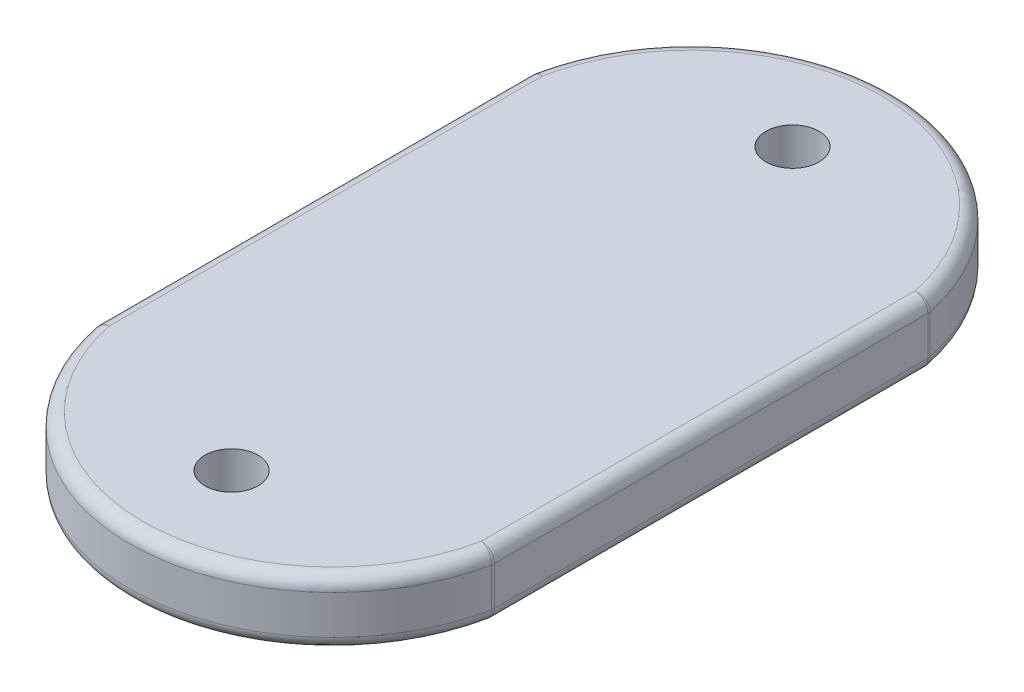
ISO-10303-21;
HEADER;
FILE_DESCRIPTION(('STEP AP214'),'2;1');
FILE_NAME('part.step','',(''),(''),'','','');
FILE_SCHEMA(('AUTOMOTIVE_DESIGN { 1 0 10303 214 1 1 1 1 }'));
ENDSEC;
DATA;
#1=APPLICATION_CONTEXT('core data for automotive mechanical design processes');
#2=APPLICATION_PROTOCOL_DEFINITION('international standard','automotive_design',2000,#1);
#3=PRODUCT_CONTEXT('',#1,'mechanical');
#4=PRODUCT('Part','Part','',(#3));
#5=PRODUCT_RELATED_PRODUCT_CATEGORY('part','',(#4));
#6=PRODUCT_DEFINITION_FORMATION('','',#4);
#7=PRODUCT_DEFINITION_CONTEXT('part definition',#1,'design');
#8=PRODUCT_DEFINITION('design','',#6,#7);
#9=PRODUCT_DEFINITION_SHAPE('','',#8);
#10=(LENGTH_UNIT() NAMED_UNIT(*) SI_UNIT(.MILLI.,.METRE.));
#11=(NAMED_UNIT(*) PLANE_ANGLE_UNIT() SI_UNIT($,.RADIAN.));
#12=(NAMED_UNIT(*) SI_UNIT($,.STERADIAN.) SOLID_ANGLE_UNIT());
#13=UNCERTAINTY_MEASURE_WITH_UNIT(LENGTH_MEASURE(1.E-05),#10,'distance_accuracy_value','');
#14=(GEOMETRIC_REPRESENTATION_CONTEXT(3) GLOBAL_UNCERTAINTY_ASSIGNED_CONTEXT((#13)) GLOBAL_UNIT_ASSIGNED_CONTEXT((#10,
#11,#12)) REPRESENTATION_CONTEXT('',''));
#15=CARTESIAN_POINT('',(0.,0.,0.));
#16=DIRECTION('',(0.,0.,1.));
#17=DIRECTION('',(1.,0.,0.));
#18=AXIS2_PLACEMENT_3D('',#15,#16,#17);
#19=CARTESIAN_POINT('',(0.,10.1031353824411,0.));
#20=DIRECTION('',(0.,1.,0.));
#21=DIRECTION('',(0.,0.,1.));
#22=AXIS2_PLACEMENT_3D('',#19,#20,#21);
#23=PLANE('',#22);
#24=CARTESIAN_POINT('',(0.,10.1031353824411,7.82020619932748));
#25=DIRECTION('',(0.,1.,0.));
#26=DIRECTION('',(0.,0.,1.));
#27=AXIS2_PLACEMENT_3D('',#24,#25,#26);
#28=CIRCLE('',#27,2.05);
#29=CARTESIAN_POINT('',(0.,10.1031353824411,9.87020619932748));
#30=VERTEX_POINT('',#29);
#31=EDGE_CURVE('E172',#30,#30,#28,.T.);
#32=ORIENTED_EDGE('',*,*,#31,.T.);
#33=EDGE_LOOP('',(#32));
#34=FACE_BOUND('',#33,.T.);
#35=CARTESIAN_POINT('',(0.,10.1031353824411,-27.6));
#36=DIRECTION('',(0.,1.,0.));
#37=DIRECTION('',(0.,0.,1.));
#38=AXIS2_PLACEMENT_3D('',#35,#36,#37);
#39=CIRCLE('',#38,14.640412398655);
#40=CARTESIAN_POINT('',(-14.35,10.1031353824411,-30.5015815002667));
#41=VERTEX_POINT('',#40);
#42=CARTESIAN_POINT('',(14.35,10.1031353824411,-30.5015815002668));
#43=VERTEX_POINT('',#42);
#44=EDGE_CURVE('E189',#41,#43,#39,.F.);
#45=ORIENTED_EDGE('',*,*,#44,.T.);
#46=DIRECTION('',(0.,0.,1.));
#47=VECTOR('',#46,1.);
#48=CARTESIAN_POINT('',(14.35,10.1031353824411,3.));
#49=LINE('',#48,#47);
#50=CARTESIAN_POINT('',(14.35,10.1031353824411,2.90158150026672));
#51=VERTEX_POINT('',#50);
#52=EDGE_CURVE('E191',#43,#51,#49,.T.);
#53=ORIENTED_EDGE('',*,*,#52,.T.);
#54=CARTESIAN_POINT('',(0.,10.1031353824411,0.));
#55=DIRECTION('',(0.,1.,0.));
#56=DIRECTION('',(0.,0.,1.));
#57=AXIS2_PLACEMENT_3D('',#54,#55,#56);
#58=CIRCLE('',#57,14.640412398655);
#59=CARTESIAN_POINT('',(-14.35,10.1031353824411,2.90158150026674));
#60=VERTEX_POINT('',#59);
#61=EDGE_CURVE('E193',#51,#60,#58,.F.);
#62=ORIENTED_EDGE('',*,*,#61,.T.);
#63=DIRECTION('',(0.,0.,1.));
#64=VECTOR('',#63,1.);
#65=CARTESIAN_POINT('',(-14.35,10.1031353824411,0.));
#66=LINE('',#65,#64);
#67=EDGE_CURVE('E187',#60,#41,#66,.F.);
#68=ORIENTED_EDGE('',*,*,#67,.T.);
#69=EDGE_LOOP('',(#45,#53,#62,#68));
#70=FACE_BOUND('',#69,.T.);
#71=CARTESIAN_POINT('',(0.,10.1031353824411,-35.4202061993275));
#72=DIRECTION('',(0.,1.,0.));
#73=DIRECTION('',(0.,0.,1.));
#74=AXIS2_PLACEMENT_3D('',#71,#72,#73);
#75=CIRCLE('',#74,2.05);
#76=CARTESIAN_POINT('',(0.,10.1031353824411,-33.3702061993275));
#77=VERTEX_POINT('',#76);
#78=EDGE_CURVE('E271',#77,#77,#75,.T.);
#79=ORIENTED_EDGE('',*,*,#78,.T.);
#80=EDGE_LOOP('',(#79));
#81=FACE_BOUND('',#80,.T.);
#82=ADVANCED_FACE('F42',(#34,#70,#81),#23,.F.);
#83=CARTESIAN_POINT('',(0.,15.1031353824411,-27.6));
#84=DIRECTION('',(0.,-1.,0.));
#85=DIRECTION('',(0.,0.,-1.));
#86=AXIS2_PLACEMENT_3D('',#83,#84,#85);
#87=CYLINDRICAL_SURFACE('',#86,15.640412398655);
#88=CARTESIAN_POINT('',(0.,14.1031353824411,-27.6));
#89=DIRECTION('',(0.,1.,0.));
#90=DIRECTION('',(0.,0.,1.));
#91=AXIS2_PLACEMENT_3D('',#88,#89,#90);
#92=CIRCLE('',#91,15.640412398655);
#93=CARTESIAN_POINT('',(-15.3301636462999,14.1031353824411,-30.6997713750638));
#94=VERTEX_POINT('',#93);
#95=CARTESIAN_POINT('',(15.3301636462999,14.1031353824411,-30.6997713750638));
#96=VERTEX_POINT('',#95);
#97=EDGE_CURVE('E148',#94,#96,#92,.F.);
#98=ORIENTED_EDGE('',*,*,#97,.T.);
#99=DIRECTION('',(0.,-1.,0.));
#100=VECTOR('',#99,1.);
#101=CARTESIAN_POINT('',(15.3301636462999,15.1031353824411,-30.6997713750638));
#102=LINE('',#101,#100);
#103=CARTESIAN_POINT('',(15.3301636462999,11.1031353824411,-30.6997713750638));
#104=VERTEX_POINT('',#103);
#105=EDGE_CURVE('E210',#96,#104,#102,.T.);
#106=ORIENTED_EDGE('',*,*,#105,.T.);
#107=CARTESIAN_POINT('',(0.,11.1031353824411,-27.6));
#108=DIRECTION('',(0.,1.,0.));
#109=DIRECTION('',(0.,0.,1.));
#110=AXIS2_PLACEMENT_3D('',#107,#108,#109);
#111=CIRCLE('',#110,15.640412398655);
#112=CARTESIAN_POINT('',(-15.3301636462999,11.1031353824411,-30.6997713750638));
#113=VERTEX_POINT('',#112);
#114=EDGE_CURVE('E207',#104,#113,#111,.T.);
#115=ORIENTED_EDGE('',*,*,#114,.T.);
#116=DIRECTION('',(0.,-1.,0.));
#117=VECTOR('',#116,1.);
#118=CARTESIAN_POINT('',(-15.3301636462999,15.1031353824411,-30.6997713750638));
#119=LINE('',#118,#117);
#120=EDGE_CURVE('E205',#113,#94,#119,.F.);
#121=ORIENTED_EDGE('',*,*,#120,.T.);
#122=EDGE_LOOP('',(#98,#106,#115,#121));
#123=FACE_BOUND('',#122,.T.);
#124=ADVANCED_FACE('F299',(#123),#87,.T.);
#125=CARTESIAN_POINT('',(-15.35,15.1031353824411,0.));
#126=DIRECTION('',(1.,0.,0.));
#127=DIRECTION('',(0.,0.,-1.));
#128=AXIS2_PLACEMENT_3D('',#125,#126,#127);
#129=PLANE('',#128);
#130=DIRECTION('',(0.,0.,1.));
#131=VECTOR('',#130,1.);
#132=CARTESIAN_POINT('',(-15.35,14.1031353824411,-30.6));
#133=LINE('',#132,#131);
#134=CARTESIAN_POINT('',(-15.35,14.1031353824411,2.90158150026671));
#135=VERTEX_POINT('',#134);
#136=CARTESIAN_POINT('',(-15.35,14.1031353824411,-30.5015815002667));
#137=VERTEX_POINT('',#136);
#138=EDGE_CURVE('E51',#135,#137,#133,.F.);
#139=ORIENTED_EDGE('',*,*,#138,.T.);
#140=DIRECTION('',(0.,1.,0.));
#141=VECTOR('',#140,1.);
#142=CARTESIAN_POINT('',(-15.35,10.1031353824411,-30.5015815002667));
#143=LINE('',#142,#141);
#144=CARTESIAN_POINT('',(-15.35,11.1031353824411,-30.5015815002667));
#145=VERTEX_POINT('',#144);
#146=EDGE_CURVE('E11',#137,#145,#143,.F.);
#147=ORIENTED_EDGE('',*,*,#146,.T.);
#148=DIRECTION('',(0.,0.,1.));
#149=VECTOR('',#148,1.);
#150=CARTESIAN_POINT('',(-15.35,11.1031353824411,0.));
#151=LINE('',#150,#149);
#152=CARTESIAN_POINT('',(-15.35,11.1031353824411,2.90158150026671));
#153=VERTEX_POINT('',#152);
#154=EDGE_CURVE('E213',#145,#153,#151,.T.);
#155=ORIENTED_EDGE('',*,*,#154,.T.);
#156=DIRECTION('',(0.,-1.,0.));
#157=VECTOR('',#156,1.);
#158=CARTESIAN_POINT('',(-15.35,15.1031353824411,2.90158150026671));
#159=LINE('',#158,#157);
#160=EDGE_CURVE('E62',#153,#135,#159,.F.);
#161=ORIENTED_EDGE('',*,*,#160,.T.);
#162=EDGE_LOOP('',(#139,#147,#155,#161));
#163=FACE_BOUND('',#162,.T.);
#164=ADVANCED_FACE('F330',(#163),#129,.F.);
#165=CARTESIAN_POINT('',(0.,15.1031353824411,0.));
#166=DIRECTION('',(0.,-1.,0.));
#167=DIRECTION('',(0.,0.,-1.));
#168=AXIS2_PLACEMENT_3D('',#165,#166,#167);
#169=CYLINDRICAL_SURFACE('',#168,15.640412398655);
#170=CARTESIAN_POINT('',(0.,11.1031353824411,0.));
#171=DIRECTION('',(0.,1.,0.));
#172=DIRECTION('',(0.,0.,1.));
#173=AXIS2_PLACEMENT_3D('',#170,#171,#172);
#174=CIRCLE('',#173,15.640412398655);
#175=CARTESIAN_POINT('',(-15.3301636462999,11.1031353824411,3.09977137506376));
#176=VERTEX_POINT('',#175);
#177=CARTESIAN_POINT('',(15.3301636462999,11.1031353824411,3.09977137506374));
#178=VERTEX_POINT('',#177);
#179=EDGE_CURVE('E180',#176,#178,#174,.T.);
#180=ORIENTED_EDGE('',*,*,#179,.T.);
#181=DIRECTION('',(0.,-1.,0.));
#182=VECTOR('',#181,1.);
#183=CARTESIAN_POINT('',(15.3301636462999,15.1031353824411,3.09977137506374));
#184=LINE('',#183,#182);
#185=CARTESIAN_POINT('',(15.3301636462999,14.1031353824411,3.09977137506374));
#186=VERTEX_POINT('',#185);
#187=EDGE_CURVE('E185',#178,#186,#184,.F.);
#188=ORIENTED_EDGE('',*,*,#187,.T.);
#189=CARTESIAN_POINT('',(0.,14.1031353824411,0.));
#190=DIRECTION('',(0.,1.,0.));
#191=DIRECTION('',(0.,0.,1.));
#192=AXIS2_PLACEMENT_3D('',#189,#190,#191);
#193=CIRCLE('',#192,15.640412398655);
#194=CARTESIAN_POINT('',(-15.3301636462999,14.1031353824411,3.09977137506376));
#195=VERTEX_POINT('',#194);
#196=EDGE_CURVE('E182',#186,#195,#193,.F.);
#197=ORIENTED_EDGE('',*,*,#196,.T.);
#198=DIRECTION('',(0.,-1.,0.));
#199=VECTOR('',#198,1.);
#200=CARTESIAN_POINT('',(-15.3301636462999,15.1031353824411,3.09977137506377));
#201=LINE('',#200,#199);
#202=EDGE_CURVE('E178',#195,#176,#201,.T.);
#203=ORIENTED_EDGE('',*,*,#202,.T.);
#204=EDGE_LOOP('',(#180,#188,#197,#203));
#205=FACE_BOUND('',#204,.T.);
#206=ADVANCED_FACE('F332',(#205),#169,.T.);
#207=CARTESIAN_POINT('',(15.35,15.1031353824411,0.));
#208=DIRECTION('',(1.,0.,0.));
#209=DIRECTION('',(0.,0.,-1.));
#210=AXIS2_PLACEMENT_3D('',#207,#208,#209);
#211=PLANE('',#210);
#212=DIRECTION('',(0.,0.,1.));
#213=VECTOR('',#212,1.);
#214=CARTESIAN_POINT('',(15.35,14.1031353824411,0.));
#215=LINE('',#214,#213);
#216=CARTESIAN_POINT('',(15.35,14.1031353824411,-30.5015815002667));
#217=VERTEX_POINT('',#216);
#218=CARTESIAN_POINT('',(15.35,14.1031353824411,2.90158150026669));
#219=VERTEX_POINT('',#218);
#220=EDGE_CURVE('E200',#217,#219,#215,.T.);
#221=ORIENTED_EDGE('',*,*,#220,.T.);
#222=DIRECTION('',(0.,1.,0.));
#223=VECTOR('',#222,1.);
#224=CARTESIAN_POINT('',(15.35,10.1031353824411,2.90158150026669));
#225=LINE('',#224,#223);
#226=CARTESIAN_POINT('',(15.35,11.1031353824411,2.90158150026669));
#227=VERTEX_POINT('',#226);
#228=EDGE_CURVE('E202',#219,#227,#225,.F.);
#229=ORIENTED_EDGE('',*,*,#228,.T.);
#230=DIRECTION('',(0.,0.,1.));
#231=VECTOR('',#230,1.);
#232=CARTESIAN_POINT('',(15.35,11.1031353824411,-30.6));
#233=LINE('',#232,#231);
#234=CARTESIAN_POINT('',(15.35,11.1031353824411,-30.5015815002667));
#235=VERTEX_POINT('',#234);
#236=EDGE_CURVE('E198',#227,#235,#233,.F.);
#237=ORIENTED_EDGE('',*,*,#236,.T.);
#238=DIRECTION('',(0.,-1.,0.));
#239=VECTOR('',#238,1.);
#240=CARTESIAN_POINT('',(15.35,15.1031353824411,-30.5015815002667));
#241=LINE('',#240,#239);
#242=EDGE_CURVE('E196',#235,#217,#241,.F.);
#243=ORIENTED_EDGE('',*,*,#242,.T.);
#244=EDGE_LOOP('',(#221,#229,#237,#243));
#245=FACE_BOUND('',#244,.T.);
#246=ADVANCED_FACE('F338',(#245),#211,.T.);
#247=CARTESIAN_POINT('',(0.,15.1031353824411,-35.4202061993275));
#248=DIRECTION('',(0.,-1.,0.));
#249=DIRECTION('',(0.,0.,-1.));
#250=AXIS2_PLACEMENT_3D('',#247,#248,#249);
#251=CYLINDRICAL_SURFACE('',#250,2.05);
#252=CARTESIAN_POINT('',(0.,15.1031353824411,-35.4202061993275));
#253=DIRECTION('',(0.,1.,0.));
#254=DIRECTION('',(0.,0.,1.));
#255=AXIS2_PLACEMENT_3D('',#252,#253,#254);
#256=CIRCLE('',#255,2.05);
#257=CARTESIAN_POINT('',(0.,15.1031353824411,-33.3702061993275));
#258=VERTEX_POINT('',#257);
#259=EDGE_CURVE('E169',#258,#258,#256,.T.);
#260=ORIENTED_EDGE('',*,*,#259,.T.);
#261=EDGE_LOOP('',(#260));
#262=FACE_BOUND('',#261,.T.);
#263=ORIENTED_EDGE('',*,*,#78,.F.);
#264=EDGE_LOOP('',(#263));
#265=FACE_BOUND('',#264,.T.);
#266=ADVANCED_FACE('F284',(#262,#265),#251,.F.);
#267=CARTESIAN_POINT('',(0.,15.1031353824411,7.82020619932748));
#268=DIRECTION('',(0.,-1.,0.));
#269=DIRECTION('',(0.,0.,-1.));
#270=AXIS2_PLACEMENT_3D('',#267,#268,#269);
#271=CYLINDRICAL_SURFACE('',#270,2.05);
#272=CARTESIAN_POINT('',(0.,15.1031353824411,7.82020619932748));
#273=DIRECTION('',(0.,1.,0.));
#274=DIRECTION('',(0.,0.,1.));
#275=AXIS2_PLACEMENT_3D('',#272,#273,#274);
#276=CIRCLE('',#275,2.05);
#277=CARTESIAN_POINT('',(0.,15.1031353824411,9.87020619932748));
#278=VERTEX_POINT('',#277);
#279=EDGE_CURVE('E166',#278,#278,#276,.T.);
#280=ORIENTED_EDGE('',*,*,#279,.T.);
#281=EDGE_LOOP('',(#280));
#282=FACE_BOUND('',#281,.T.);
#283=ORIENTED_EDGE('',*,*,#31,.F.);
#284=EDGE_LOOP('',(#283));
#285=FACE_BOUND('',#284,.T.);
#286=ADVANCED_FACE('F288',(#282,#285),#271,.F.);
#287=CARTESIAN_POINT('',(0.,15.1031353824411,0.));
#288=DIRECTION('',(0.,1.,0.));
#289=DIRECTION('',(0.,0.,1.));
#290=AXIS2_PLACEMENT_3D('',#287,#288,#289);
#291=PLANE('',#290);
#292=DIRECTION('',(0.,0.,1.));
#293=VECTOR('',#292,1.);
#294=CARTESIAN_POINT('',(-14.35,15.1031353824411,3.));
#295=LINE('',#294,#293);
#296=CARTESIAN_POINT('',(-14.35,15.1031353824411,-30.5015815002667));
#297=VERTEX_POINT('',#296);
#298=CARTESIAN_POINT('',(-14.35,15.1031353824411,2.90158150026674));
#299=VERTEX_POINT('',#298);
#300=EDGE_CURVE('E135',#297,#299,#295,.T.);
#301=ORIENTED_EDGE('',*,*,#300,.T.);
#302=CARTESIAN_POINT('',(0.,15.1031353824411,0.));
#303=DIRECTION('',(0.,1.,0.));
#304=DIRECTION('',(0.,0.,1.));
#305=AXIS2_PLACEMENT_3D('',#302,#303,#304);
#306=CIRCLE('',#305,14.640412398655);
#307=CARTESIAN_POINT('',(14.35,15.1031353824411,2.90158150026672));
#308=VERTEX_POINT('',#307);
#309=EDGE_CURVE('E176',#299,#308,#306,.T.);
#310=ORIENTED_EDGE('',*,*,#309,.T.);
#311=DIRECTION('',(0.,0.,1.));
#312=VECTOR('',#311,1.);
#313=CARTESIAN_POINT('',(14.35,15.1031353824411,0.));
#314=LINE('',#313,#312);
#315=CARTESIAN_POINT('',(14.35,15.1031353824411,-30.5015815002668));
#316=VERTEX_POINT('',#315);
#317=EDGE_CURVE('E138',#308,#316,#314,.F.);
#318=ORIENTED_EDGE('',*,*,#317,.T.);
#319=CARTESIAN_POINT('',(0.,15.1031353824411,-27.6));
#320=DIRECTION('',(0.,1.,0.));
#321=DIRECTION('',(0.,0.,1.));
#322=AXIS2_PLACEMENT_3D('',#319,#320,#321);
#323=CIRCLE('',#322,14.640412398655);
#324=EDGE_CURVE('E129',#316,#297,#323,.T.);
#325=ORIENTED_EDGE('',*,*,#324,.T.);
#326=EDGE_LOOP('',(#301,#310,#318,#325));
#327=FACE_BOUND('',#326,.T.);
#328=ORIENTED_EDGE('',*,*,#259,.F.);
#329=EDGE_LOOP('',(#328));
#330=FACE_BOUND('',#329,.T.);
#331=ORIENTED_EDGE('',*,*,#279,.F.);
#332=EDGE_LOOP('',(#331));
#333=FACE_BOUND('',#332,.T.);
#334=ADVANCED_FACE('F131',(#327,#330,#333),#291,.T.);
#335=CARTESIAN_POINT('',(0.,11.1031353824411,-27.6));
#336=DIRECTION('',(0.,1.,0.));
#337=DIRECTION('',(0.,0.,1.));
#338=AXIS2_PLACEMENT_3D('',#335,#336,#337);
#339=TOROIDAL_SURFACE('',#338,14.640412398655,1.);
#340=CARTESIAN_POINT('',(-14.35,11.1031353824411,-30.5015815002667));
#341=DIRECTION('',(-0.198189874797056,0.,0.980163646299906));
#342=DIRECTION('',(0.980163646299906,0.,0.198189874797056));
#343=AXIS2_PLACEMENT_3D('',#340,#341,#342);
#344=CIRCLE('',#343,1.);
#345=EDGE_CURVE('E46',#113,#41,#344,.T.);
#346=ORIENTED_EDGE('',*,*,#345,.F.);
#347=ORIENTED_EDGE('',*,*,#114,.F.);
#348=CARTESIAN_POINT('',(14.35,11.1031353824411,-30.5015815002668));
#349=DIRECTION('',(0.198189874797031,0.,0.980163646299911));
#350=DIRECTION('',(0.980163646299911,0.,-0.198189874797031));
#351=AXIS2_PLACEMENT_3D('',#348,#349,#350);
#352=CIRCLE('',#351,1.);
#353=EDGE_CURVE('E263',#43,#104,#352,.T.);
#354=ORIENTED_EDGE('',*,*,#353,.F.);
#355=ORIENTED_EDGE('',*,*,#44,.F.);
#356=EDGE_LOOP('',(#346,#347,#354,#355));
#357=FACE_BOUND('',#356,.T.);
#358=ADVANCED_FACE('F44',(#357),#339,.T.);
#359=CARTESIAN_POINT('',(-14.35,11.1031353824411,-30.5015815002667));
#360=DIRECTION('',(0.,-1.,0.));
#361=DIRECTION('',(0.,0.,-1.));
#362=AXIS2_PLACEMENT_3D('',#359,#360,#361);
#363=SPHERICAL_SURFACE('',#362,1.);
#364=CARTESIAN_POINT('',(-14.35,11.1031353824411,-30.5015815002667));
#365=DIRECTION('',(0.,-1.,0.));
#366=DIRECTION('',(0.,0.,-1.));
#367=AXIS2_PLACEMENT_3D('',#364,#365,#366);
#368=CIRCLE('',#367,1.);
#369=EDGE_CURVE('E258',#113,#145,#368,.F.);
#370=ORIENTED_EDGE('',*,*,#369,.F.);
#371=ORIENTED_EDGE('',*,*,#345,.T.);
#372=CARTESIAN_POINT('',(-14.35,11.1031353824411,-30.5015815002667));
#373=DIRECTION('',(0.,0.,-1.));
#374=DIRECTION('',(-1.,0.,0.));
#375=AXIS2_PLACEMENT_3D('',#372,#373,#374);
#376=CIRCLE('',#375,1.);
#377=EDGE_CURVE('E261',#145,#41,#376,.F.);
#378=ORIENTED_EDGE('',*,*,#377,.F.);
#379=EDGE_LOOP('',(#370,#371,#378));
#380=FACE_BOUND('',#379,.T.);
#381=ADVANCED_FACE('F326',(#380),#363,.T.);
#382=CARTESIAN_POINT('',(14.35,11.1031353824411,-30.5015815002667));
#383=DIRECTION('',(0.,-1.,0.));
#384=DIRECTION('',(0.,0.,-1.));
#385=AXIS2_PLACEMENT_3D('',#382,#383,#384);
#386=SPHERICAL_SURFACE('',#385,1.);
#387=CARTESIAN_POINT('',(14.35,11.1031353824411,-30.5015815002667));
#388=DIRECTION('',(0.,0.,-1.));
#389=DIRECTION('',(0.,1.,0.));
#390=AXIS2_PLACEMENT_3D('',#387,#388,#389);
#391=CIRCLE('',#390,1.);
#392=EDGE_CURVE('E253',#43,#235,#391,.F.);
#393=ORIENTED_EDGE('',*,*,#392,.F.);
#394=ORIENTED_EDGE('',*,*,#353,.T.);
#395=CARTESIAN_POINT('',(14.35,11.1031353824411,-30.5015815002667));
#396=DIRECTION('',(0.,-1.,0.));
#397=DIRECTION('',(0.,0.,-1.));
#398=AXIS2_PLACEMENT_3D('',#395,#396,#397);
#399=CIRCLE('',#398,1.);
#400=EDGE_CURVE('E256',#235,#104,#399,.F.);
#401=ORIENTED_EDGE('',*,*,#400,.F.);
#402=EDGE_LOOP('',(#393,#394,#401));
#403=FACE_BOUND('',#402,.T.);
#404=ADVANCED_FACE('F306',(#403),#386,.T.);
#405=CARTESIAN_POINT('',(-14.35,11.1031353824411,0.));
#406=DIRECTION('',(0.,0.,1.));
#407=DIRECTION('',(1.,0.,0.));
#408=AXIS2_PLACEMENT_3D('',#405,#406,#407);
#409=CYLINDRICAL_SURFACE('',#408,1.);
#410=ORIENTED_EDGE('',*,*,#377,.T.);
#411=ORIENTED_EDGE('',*,*,#67,.F.);
#412=CARTESIAN_POINT('',(-14.35,11.1031353824411,2.90158150026671));
#413=DIRECTION('',(0.,0.,1.));
#414=DIRECTION('',(0.,-1.,0.));
#415=AXIS2_PLACEMENT_3D('',#412,#413,#414);
#416=CIRCLE('',#415,1.);
#417=EDGE_CURVE('E248',#153,#60,#416,.T.);
#418=ORIENTED_EDGE('',*,*,#417,.F.);
#419=ORIENTED_EDGE('',*,*,#154,.F.);
#420=EDGE_LOOP('',(#410,#411,#418,#419));
#421=FACE_BOUND('',#420,.T.);
#422=ADVANCED_FACE('F325',(#421),#409,.T.);
#423=CARTESIAN_POINT('',(-14.35,15.1031353824411,-30.5015815002667));
#424=DIRECTION('',(0.,-1.,0.));
#425=DIRECTION('',(0.,0.,-1.));
#426=AXIS2_PLACEMENT_3D('',#423,#424,#425);
#427=CYLINDRICAL_SURFACE('',#426,1.);
#428=ORIENTED_EDGE('',*,*,#369,.T.);
#429=ORIENTED_EDGE('',*,*,#146,.F.);
#430=CARTESIAN_POINT('',(-14.35,14.1031353824411,-30.5015815002667));
#431=DIRECTION('',(0.,1.,0.));
#432=DIRECTION('',(0.,0.,1.));
#433=AXIS2_PLACEMENT_3D('',#430,#431,#432);
#434=CIRCLE('',#433,1.);
#435=EDGE_CURVE('E152',#94,#137,#434,.T.);
#436=ORIENTED_EDGE('',*,*,#435,.F.);
#437=ORIENTED_EDGE('',*,*,#120,.F.);
#438=EDGE_LOOP('',(#428,#429,#436,#437));
#439=FACE_BOUND('',#438,.T.);
#440=ADVANCED_FACE('F329',(#439),#427,.T.);
#441=CARTESIAN_POINT('',(0.,14.1031353824411,-27.6));
#442=DIRECTION('',(0.,1.,0.));
#443=DIRECTION('',(0.,0.,1.));
#444=AXIS2_PLACEMENT_3D('',#441,#442,#443);
#445=TOROIDAL_SURFACE('',#444,14.640412398655,1.);
#446=CARTESIAN_POINT('',(14.35,14.1031353824411,-30.5015815002667));
#447=DIRECTION('',(0.198189874797059,0.,0.980163646299905));
#448=DIRECTION('',(0.980163646299905,0.,-0.198189874797059));
#449=AXIS2_PLACEMENT_3D('',#446,#447,#448);
#450=CIRCLE('',#449,1.);
#451=EDGE_CURVE('E153',#96,#316,#450,.T.);
#452=ORIENTED_EDGE('',*,*,#451,.F.);
#453=ORIENTED_EDGE('',*,*,#97,.F.);
#454=CARTESIAN_POINT('',(-14.35,14.1031353824411,-30.5015815002667));
#455=DIRECTION('',(-0.198189874797031,0.,0.980163646299911));
#456=DIRECTION('',(0.980163646299911,0.,0.198189874797031));
#457=AXIS2_PLACEMENT_3D('',#454,#455,#456);
#458=CIRCLE('',#457,1.);
#459=EDGE_CURVE('E145',#297,#94,#458,.T.);
#460=ORIENTED_EDGE('',*,*,#459,.F.);
#461=ORIENTED_EDGE('',*,*,#324,.F.);
#462=EDGE_LOOP('',(#452,#453,#460,#461));
#463=FACE_BOUND('',#462,.T.);
#464=ADVANCED_FACE('F147',(#463),#445,.T.);
#465=CARTESIAN_POINT('',(14.35,15.1031353824411,-30.5015815002667));
#466=DIRECTION('',(0.,-1.,0.));
#467=DIRECTION('',(0.,0.,-1.));
#468=AXIS2_PLACEMENT_3D('',#465,#466,#467);
#469=CYLINDRICAL_SURFACE('',#468,1.);
#470=ORIENTED_EDGE('',*,*,#400,.T.);
#471=ORIENTED_EDGE('',*,*,#105,.F.);
#472=CARTESIAN_POINT('',(14.35,14.1031353824411,-30.5015815002667));
#473=DIRECTION('',(0.,1.,0.));
#474=DIRECTION('',(0.,0.,1.));
#475=AXIS2_PLACEMENT_3D('',#472,#473,#474);
#476=CIRCLE('',#475,1.);
#477=EDGE_CURVE('E243',#217,#96,#476,.T.);
#478=ORIENTED_EDGE('',*,*,#477,.F.);
#479=ORIENTED_EDGE('',*,*,#242,.F.);
#480=EDGE_LOOP('',(#470,#471,#478,#479));
#481=FACE_BOUND('',#480,.T.);
#482=ADVANCED_FACE('F388',(#481),#469,.T.);
#483=CARTESIAN_POINT('',(14.35,11.1031353824411,0.));
#484=DIRECTION('',(0.,0.,-1.));
#485=DIRECTION('',(-1.,0.,0.));
#486=AXIS2_PLACEMENT_3D('',#483,#484,#485);
#487=CYLINDRICAL_SURFACE('',#486,1.);
#488=ORIENTED_EDGE('',*,*,#392,.T.);
#489=ORIENTED_EDGE('',*,*,#236,.F.);
#490=CARTESIAN_POINT('',(14.35,11.1031353824411,2.90158150026672));
#491=DIRECTION('',(0.,0.,1.));
#492=DIRECTION('',(1.,0.,0.));
#493=AXIS2_PLACEMENT_3D('',#490,#491,#492);
#494=CIRCLE('',#493,1.);
#495=EDGE_CURVE('E240',#51,#227,#494,.T.);
#496=ORIENTED_EDGE('',*,*,#495,.F.);
#497=ORIENTED_EDGE('',*,*,#52,.F.);
#498=EDGE_LOOP('',(#488,#489,#496,#497));
#499=FACE_BOUND('',#498,.T.);
#500=ADVANCED_FACE('F311',(#499),#487,.T.);
#501=CARTESIAN_POINT('',(0.,11.1031353824411,0.));
#502=DIRECTION('',(0.,1.,0.));
#503=DIRECTION('',(0.,0.,1.));
#504=AXIS2_PLACEMENT_3D('',#501,#502,#503);
#505=TOROIDAL_SURFACE('',#504,14.640412398655,1.);
#506=CARTESIAN_POINT('',(-14.35,11.1031353824411,2.90158150026674));
#507=DIRECTION('',(-0.198189874797026,0.,-0.980163646299912));
#508=DIRECTION('',(-0.980163646299912,0.,0.198189874797026));
#509=AXIS2_PLACEMENT_3D('',#506,#507,#508);
#510=CIRCLE('',#509,1.);
#511=EDGE_CURVE('E250',#60,#176,#510,.T.);
#512=ORIENTED_EDGE('',*,*,#511,.F.);
#513=ORIENTED_EDGE('',*,*,#61,.F.);
#514=CARTESIAN_POINT('',(14.35,11.1031353824411,2.90158150026669));
#515=DIRECTION('',(0.198189874797055,0.,-0.980163646299906));
#516=DIRECTION('',(-0.980163646299906,0.,-0.198189874797056));
#517=AXIS2_PLACEMENT_3D('',#514,#515,#516);
#518=CIRCLE('',#517,1.);
#519=EDGE_CURVE('E237',#178,#51,#518,.T.);
#520=ORIENTED_EDGE('',*,*,#519,.F.);
#521=ORIENTED_EDGE('',*,*,#179,.F.);
#522=EDGE_LOOP('',(#512,#513,#520,#521));
#523=FACE_BOUND('',#522,.T.);
#524=ADVANCED_FACE('F320',(#523),#505,.T.);
#525=CARTESIAN_POINT('',(-14.35,11.1031353824411,2.9015815002667));
#526=DIRECTION('',(0.,-1.,0.));
#527=DIRECTION('',(0.,0.,-1.));
#528=AXIS2_PLACEMENT_3D('',#525,#526,#527);
#529=SPHERICAL_SURFACE('',#528,1.);
#530=ORIENTED_EDGE('',*,*,#417,.T.);
#531=ORIENTED_EDGE('',*,*,#511,.T.);
#532=CARTESIAN_POINT('',(-14.35,11.1031353824411,2.90158150026671));
#533=DIRECTION('',(0.,-1.,0.));
#534=DIRECTION('',(0.,0.,-1.));
#535=AXIS2_PLACEMENT_3D('',#532,#533,#534);
#536=CIRCLE('',#535,1.);
#537=EDGE_CURVE('E159',#153,#176,#536,.F.);
#538=ORIENTED_EDGE('',*,*,#537,.F.);
#539=EDGE_LOOP('',(#530,#531,#538));
#540=FACE_BOUND('',#539,.T.);
#541=ADVANCED_FACE('F381',(#540),#529,.T.);
#542=CARTESIAN_POINT('',(-14.35,14.1031353824411,-30.5015815002667));
#543=DIRECTION('',(0.,1.,0.));
#544=DIRECTION('',(0.,0.,1.));
#545=AXIS2_PLACEMENT_3D('',#542,#543,#544);
#546=SPHERICAL_SURFACE('',#545,1.);
#547=ORIENTED_EDGE('',*,*,#459,.T.);
#548=ORIENTED_EDGE('',*,*,#435,.T.);
#549=CARTESIAN_POINT('',(-14.35,14.1031353824411,-30.5015815002667));
#550=DIRECTION('',(0.,0.,-1.));
#551=DIRECTION('',(0.,1.,0.));
#552=AXIS2_PLACEMENT_3D('',#549,#550,#551);
#553=CIRCLE('',#552,1.);
#554=EDGE_CURVE('E156',#297,#137,#553,.F.);
#555=ORIENTED_EDGE('',*,*,#554,.F.);
#556=EDGE_LOOP('',(#547,#548,#555));
#557=FACE_BOUND('',#556,.T.);
#558=ADVANCED_FACE('F157',(#557),#546,.T.);
#559=CARTESIAN_POINT('',(14.35,14.1031353824411,-30.5015815002667));
#560=DIRECTION('',(0.,1.,0.));
#561=DIRECTION('',(0.,0.,1.));
#562=AXIS2_PLACEMENT_3D('',#559,#560,#561);
#563=SPHERICAL_SURFACE('',#562,1.);
#564=ORIENTED_EDGE('',*,*,#477,.T.);
#565=ORIENTED_EDGE('',*,*,#451,.T.);
#566=CARTESIAN_POINT('',(14.35,14.1031353824411,-30.5015815002668));
#567=DIRECTION('',(0.,0.,-1.));
#568=DIRECTION('',(-1.,0.,0.));
#569=AXIS2_PLACEMENT_3D('',#566,#567,#568);
#570=CIRCLE('',#569,1.);
#571=EDGE_CURVE('E160',#217,#316,#570,.F.);
#572=ORIENTED_EDGE('',*,*,#571,.F.);
#573=EDGE_LOOP('',(#564,#565,#572));
#574=FACE_BOUND('',#573,.T.);
#575=ADVANCED_FACE('F375',(#574),#563,.T.);
#576=CARTESIAN_POINT('',(14.35,11.1031353824411,2.90158150026669));
#577=DIRECTION('',(0.,-1.,0.));
#578=DIRECTION('',(0.,0.,-1.));
#579=AXIS2_PLACEMENT_3D('',#576,#577,#578);
#580=SPHERICAL_SURFACE('',#579,1.);
#581=ORIENTED_EDGE('',*,*,#519,.T.);
#582=ORIENTED_EDGE('',*,*,#495,.T.);
#583=CARTESIAN_POINT('',(14.35,11.1031353824411,2.90158150026669));
#584=DIRECTION('',(0.,-1.,0.));
#585=DIRECTION('',(0.,0.,-1.));
#586=AXIS2_PLACEMENT_3D('',#583,#584,#585);
#587=CIRCLE('',#586,1.);
#588=EDGE_CURVE('E231',#178,#227,#587,.F.);
#589=ORIENTED_EDGE('',*,*,#588,.F.);
#590=EDGE_LOOP('',(#581,#582,#589));
#591=FACE_BOUND('',#590,.T.);
#592=ADVANCED_FACE('F315',(#591),#580,.T.);
#593=CARTESIAN_POINT('',(-14.35,15.1031353824411,2.90158150026671));
#594=DIRECTION('',(0.,-1.,0.));
#595=DIRECTION('',(0.,0.,-1.));
#596=AXIS2_PLACEMENT_3D('',#593,#594,#595);
#597=CYLINDRICAL_SURFACE('',#596,1.);
#598=ORIENTED_EDGE('',*,*,#537,.T.);
#599=ORIENTED_EDGE('',*,*,#202,.F.);
#600=CARTESIAN_POINT('',(-14.35,14.1031353824411,2.90158150026671));
#601=DIRECTION('',(0.,1.,0.));
#602=DIRECTION('',(0.,0.,1.));
#603=AXIS2_PLACEMENT_3D('',#600,#601,#602);
#604=CIRCLE('',#603,1.);
#605=EDGE_CURVE('E228',#135,#195,#604,.T.);
#606=ORIENTED_EDGE('',*,*,#605,.F.);
#607=ORIENTED_EDGE('',*,*,#160,.F.);
#608=EDGE_LOOP('',(#598,#599,#606,#607));
#609=FACE_BOUND('',#608,.T.);
#610=ADVANCED_FACE('F369',(#609),#597,.T.);
#611=CARTESIAN_POINT('',(-14.35,14.1031353824411,0.));
#612=DIRECTION('',(0.,0.,-1.));
#613=DIRECTION('',(-1.,0.,0.));
#614=AXIS2_PLACEMENT_3D('',#611,#612,#613);
#615=CYLINDRICAL_SURFACE('',#614,1.);
#616=ORIENTED_EDGE('',*,*,#554,.T.);
#617=ORIENTED_EDGE('',*,*,#138,.F.);
#618=CARTESIAN_POINT('',(-14.35,14.1031353824411,2.90158150026674));
#619=DIRECTION('',(0.,0.,1.));
#620=DIRECTION('',(1.,0.,0.));
#621=AXIS2_PLACEMENT_3D('',#618,#619,#620);
#622=CIRCLE('',#621,1.);
#623=EDGE_CURVE('E164',#299,#135,#622,.T.);
#624=ORIENTED_EDGE('',*,*,#623,.F.);
#625=ORIENTED_EDGE('',*,*,#300,.F.);
#626=EDGE_LOOP('',(#616,#617,#624,#625));
#627=FACE_BOUND('',#626,.T.);
#628=ADVANCED_FACE('F162',(#627),#615,.T.);
#629=CARTESIAN_POINT('',(14.35,14.1031353824411,0.));
#630=DIRECTION('',(0.,0.,1.));
#631=DIRECTION('',(1.,0.,0.));
#632=AXIS2_PLACEMENT_3D('',#629,#630,#631);
#633=CYLINDRICAL_SURFACE('',#632,1.);
#634=ORIENTED_EDGE('',*,*,#571,.T.);
#635=ORIENTED_EDGE('',*,*,#317,.F.);
#636=CARTESIAN_POINT('',(14.35,14.1031353824411,2.90158150026669));
#637=DIRECTION('',(0.,0.,1.));
#638=DIRECTION('',(0.,-1.,0.));
#639=AXIS2_PLACEMENT_3D('',#636,#637,#638);
#640=CIRCLE('',#639,1.);
#641=EDGE_CURVE('E224',#219,#308,#640,.T.);
#642=ORIENTED_EDGE('',*,*,#641,.F.);
#643=ORIENTED_EDGE('',*,*,#220,.F.);
#644=EDGE_LOOP('',(#634,#635,#642,#643));
#645=FACE_BOUND('',#644,.T.);
#646=ADVANCED_FACE('F362',(#645),#633,.T.);
#647=CARTESIAN_POINT('',(14.35,15.1031353824411,2.90158150026669));
#648=DIRECTION('',(0.,-1.,0.));
#649=DIRECTION('',(0.,0.,-1.));
#650=AXIS2_PLACEMENT_3D('',#647,#648,#649);
#651=CYLINDRICAL_SURFACE('',#650,1.);
#652=ORIENTED_EDGE('',*,*,#588,.T.);
#653=ORIENTED_EDGE('',*,*,#228,.F.);
#654=CARTESIAN_POINT('',(14.35,14.1031353824411,2.90158150026669));
#655=DIRECTION('',(0.,1.,0.));
#656=DIRECTION('',(0.,0.,1.));
#657=AXIS2_PLACEMENT_3D('',#654,#655,#656);
#658=CIRCLE('',#657,1.);
#659=EDGE_CURVE('E221',#186,#219,#658,.T.);
#660=ORIENTED_EDGE('',*,*,#659,.F.);
#661=ORIENTED_EDGE('',*,*,#187,.F.);
#662=EDGE_LOOP('',(#652,#653,#660,#661));
#663=FACE_BOUND('',#662,.T.);
#664=ADVANCED_FACE('F358',(#663),#651,.T.);
#665=CARTESIAN_POINT('',(-14.35,14.1031353824411,2.9015815002667));
#666=DIRECTION('',(0.,1.,0.));
#667=DIRECTION('',(0.,0.,1.));
#668=AXIS2_PLACEMENT_3D('',#665,#666,#667);
#669=SPHERICAL_SURFACE('',#668,1.);
#670=ORIENTED_EDGE('',*,*,#623,.T.);
#671=ORIENTED_EDGE('',*,*,#605,.T.);
#672=CARTESIAN_POINT('',(-14.35,14.1031353824411,2.90158150026671));
#673=DIRECTION('',(-0.198189874797057,0.,-0.980163646299906));
#674=DIRECTION('',(-0.980163646299906,0.,0.198189874797057));
#675=AXIS2_PLACEMENT_3D('',#672,#673,#674);
#676=CIRCLE('',#675,1.);
#677=EDGE_CURVE('E219',#299,#195,#676,.F.);
#678=ORIENTED_EDGE('',*,*,#677,.F.);
#679=EDGE_LOOP('',(#670,#671,#678));
#680=FACE_BOUND('',#679,.T.);
#681=ADVANCED_FACE('F354',(#680),#669,.T.);
#682=CARTESIAN_POINT('',(14.35,14.1031353824411,2.90158150026669));
#683=DIRECTION('',(0.,1.,0.));
#684=DIRECTION('',(0.,0.,1.));
#685=AXIS2_PLACEMENT_3D('',#682,#683,#684);
#686=SPHERICAL_SURFACE('',#685,1.);
#687=ORIENTED_EDGE('',*,*,#659,.T.);
#688=ORIENTED_EDGE('',*,*,#641,.T.);
#689=CARTESIAN_POINT('',(14.35,14.1031353824411,2.90158150026672));
#690=DIRECTION('',(0.19818987479702,0.,-0.980163646299913));
#691=DIRECTION('',(-0.980163646299913,0.,-0.19818987479702));
#692=AXIS2_PLACEMENT_3D('',#689,#690,#691);
#693=CIRCLE('',#692,1.);
#694=EDGE_CURVE('E217',#186,#308,#693,.F.);
#695=ORIENTED_EDGE('',*,*,#694,.F.);
#696=EDGE_LOOP('',(#687,#688,#695));
#697=FACE_BOUND('',#696,.T.);
#698=ADVANCED_FACE('F350',(#697),#686,.T.);
#699=CARTESIAN_POINT('',(0.,14.1031353824411,0.));
#700=DIRECTION('',(0.,1.,0.));
#701=DIRECTION('',(0.,0.,1.));
#702=AXIS2_PLACEMENT_3D('',#699,#700,#701);
#703=TOROIDAL_SURFACE('',#702,14.640412398655,1.);
#704=ORIENTED_EDGE('',*,*,#677,.T.);
#705=ORIENTED_EDGE('',*,*,#196,.F.);
#706=ORIENTED_EDGE('',*,*,#694,.T.);
#707=ORIENTED_EDGE('',*,*,#309,.F.);
#708=EDGE_LOOP('',(#704,#705,#706,#707));
#709=FACE_BOUND('',#708,.T.);
#710=ADVANCED_FACE('F347',(#709),#703,.T.);
#711=CLOSED_SHELL('',(#82,#124,#164,#206,#246,#266,#286,#334,#358,#381,#404,#422,#440,#464,#482,
#500,#524,#541,#558,#575,#592,#610,#628,#646,#664,#681,#698,#710));
#712=MANIFOLD_SOLID_BREP('B2',#711);
#713=ADVANCED_BREP_SHAPE_REPRESENTATION('',(#18,#712),#14);
#714=SHAPE_DEFINITION_REPRESENTATION(#9,#713);
ENDSEC;
END-ISO-10303-21;
